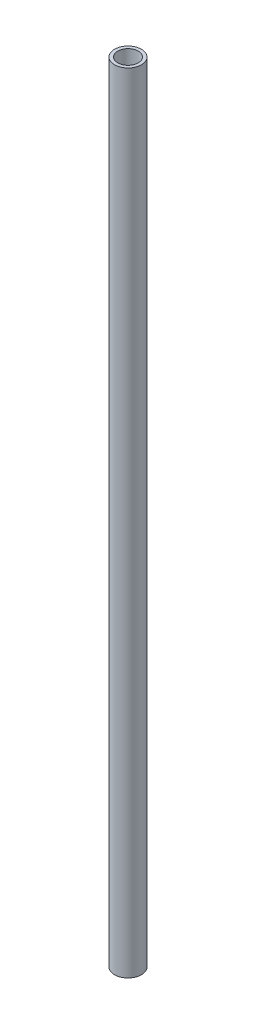
ISO-10303-21;
HEADER;
FILE_DESCRIPTION(('STEP AP214'),'2;1');
FILE_NAME('part.step','',(''),(''),'','','');
FILE_SCHEMA(('AUTOMOTIVE_DESIGN { 1 0 10303 214 1 1 1 1 }'));
ENDSEC;
DATA;
#1=APPLICATION_CONTEXT('core data for automotive mechanical design processes');
#2=APPLICATION_PROTOCOL_DEFINITION('international standard','automotive_design',2000,#1);
#3=PRODUCT_CONTEXT('',#1,'mechanical');
#4=PRODUCT('Part','Part','',(#3));
#5=PRODUCT_RELATED_PRODUCT_CATEGORY('part','',(#4));
#6=PRODUCT_DEFINITION_FORMATION('','',#4);
#7=PRODUCT_DEFINITION_CONTEXT('part definition',#1,'design');
#8=PRODUCT_DEFINITION('design','',#6,#7);
#9=PRODUCT_DEFINITION_SHAPE('','',#8);
#10=(LENGTH_UNIT() NAMED_UNIT(*) SI_UNIT(.MILLI.,.METRE.));
#11=(NAMED_UNIT(*) PLANE_ANGLE_UNIT() SI_UNIT($,.RADIAN.));
#12=(NAMED_UNIT(*) SI_UNIT($,.STERADIAN.) SOLID_ANGLE_UNIT());
#13=UNCERTAINTY_MEASURE_WITH_UNIT(LENGTH_MEASURE(1.E-05),#10,'distance_accuracy_value','');
#14=(GEOMETRIC_REPRESENTATION_CONTEXT(3) GLOBAL_UNCERTAINTY_ASSIGNED_CONTEXT((#13)) GLOBAL_UNIT_ASSIGNED_CONTEXT((#10,
#11,#12)) REPRESENTATION_CONTEXT('',''));
#15=CARTESIAN_POINT('',(0.,0.,0.));
#16=DIRECTION('',(0.,0.,1.));
#17=DIRECTION('',(1.,0.,0.));
#18=AXIS2_PLACEMENT_3D('',#15,#16,#17);
#19=CARTESIAN_POINT('',(0.,615.,0.));
#20=DIRECTION('',(0.,1.,0.));
#21=DIRECTION('',(0.,0.,1.));
#22=AXIS2_PLACEMENT_3D('',#19,#20,#21);
#23=PLANE('',#22);
#24=CARTESIAN_POINT('',(0.,615.,0.));
#25=DIRECTION('',(0.,1.,0.));
#26=DIRECTION('',(0.,0.,1.));
#27=AXIS2_PLACEMENT_3D('',#24,#25,#26);
#28=CIRCLE('',#27,21.);
#29=CARTESIAN_POINT('',(0.,615.,21.));
#30=VERTEX_POINT('',#29);
#31=EDGE_CURVE('E11',#30,#30,#28,.T.);
#32=ORIENTED_EDGE('',*,*,#31,.T.);
#33=EDGE_LOOP('',(#32));
#34=FACE_BOUND('',#33,.T.);
#35=CARTESIAN_POINT('',(0.,615.,0.));
#36=DIRECTION('',(0.,1.,0.));
#37=DIRECTION('',(1.,0.,0.));
#38=AXIS2_PLACEMENT_3D('',#35,#36,#37);
#39=CIRCLE('',#38,16.);
#40=CARTESIAN_POINT('',(16.,615.,0.));
#41=VERTEX_POINT('',#40);
#42=EDGE_CURVE('E47',#41,#41,#39,.T.);
#43=ORIENTED_EDGE('',*,*,#42,.F.);
#44=EDGE_LOOP('',(#43));
#45=FACE_BOUND('',#44,.T.);
#46=ADVANCED_FACE('F36',(#34,#45),#23,.T.);
#47=CARTESIAN_POINT('',(0.,-615.,0.));
#48=DIRECTION('',(0.,1.,0.));
#49=DIRECTION('',(0.,0.,1.));
#50=AXIS2_PLACEMENT_3D('',#47,#48,#49);
#51=PLANE('',#50);
#52=CARTESIAN_POINT('',(0.,-615.,0.));
#53=DIRECTION('',(0.,1.,0.));
#54=DIRECTION('',(0.,0.,1.));
#55=AXIS2_PLACEMENT_3D('',#52,#53,#54);
#56=CIRCLE('',#55,21.);
#57=CARTESIAN_POINT('',(0.,-615.,21.));
#58=VERTEX_POINT('',#57);
#59=EDGE_CURVE('E40',#58,#58,#56,.T.);
#60=ORIENTED_EDGE('',*,*,#59,.F.);
#61=EDGE_LOOP('',(#60));
#62=FACE_BOUND('',#61,.T.);
#63=CARTESIAN_POINT('',(0.,-615.,0.));
#64=DIRECTION('',(0.,1.,0.));
#65=DIRECTION('',(1.,0.,0.));
#66=AXIS2_PLACEMENT_3D('',#63,#64,#65);
#67=CIRCLE('',#66,16.);
#68=CARTESIAN_POINT('',(16.,-615.,0.));
#69=VERTEX_POINT('',#68);
#70=EDGE_CURVE('E49',#69,#69,#67,.T.);
#71=ORIENTED_EDGE('',*,*,#70,.T.);
#72=EDGE_LOOP('',(#71));
#73=FACE_BOUND('',#72,.T.);
#74=ADVANCED_FACE('F59',(#62,#73),#51,.F.);
#75=CARTESIAN_POINT('',(0.,615.,0.));
#76=DIRECTION('',(0.,-1.,0.));
#77=DIRECTION('',(0.,0.,-1.));
#78=AXIS2_PLACEMENT_3D('',#75,#76,#77);
#79=CYLINDRICAL_SURFACE('',#78,21.);
#80=ORIENTED_EDGE('',*,*,#31,.F.);
#81=EDGE_LOOP('',(#80));
#82=FACE_BOUND('',#81,.T.);
#83=ORIENTED_EDGE('',*,*,#59,.T.);
#84=EDGE_LOOP('',(#83));
#85=FACE_BOUND('',#84,.T.);
#86=ADVANCED_FACE('F38',(#82,#85),#79,.T.);
#87=CARTESIAN_POINT('',(0.,615.,0.));
#88=DIRECTION('',(0.,-1.,0.));
#89=DIRECTION('',(0.,0.,-1.));
#90=AXIS2_PLACEMENT_3D('',#87,#88,#89);
#91=CYLINDRICAL_SURFACE('',#90,16.);
#92=ORIENTED_EDGE('',*,*,#42,.T.);
#93=EDGE_LOOP('',(#92));
#94=FACE_BOUND('',#93,.T.);
#95=ORIENTED_EDGE('',*,*,#70,.F.);
#96=EDGE_LOOP('',(#95));
#97=FACE_BOUND('',#96,.T.);
#98=ADVANCED_FACE('F55',(#94,#97),#91,.F.);
#99=CLOSED_SHELL('',(#46,#74,#86,#98));
#100=MANIFOLD_SOLID_BREP('B2',#99);
#101=ADVANCED_BREP_SHAPE_REPRESENTATION('',(#18,#100),#14);
#102=SHAPE_DEFINITION_REPRESENTATION(#9,#101);
ENDSEC;
END-ISO-10303-21;
